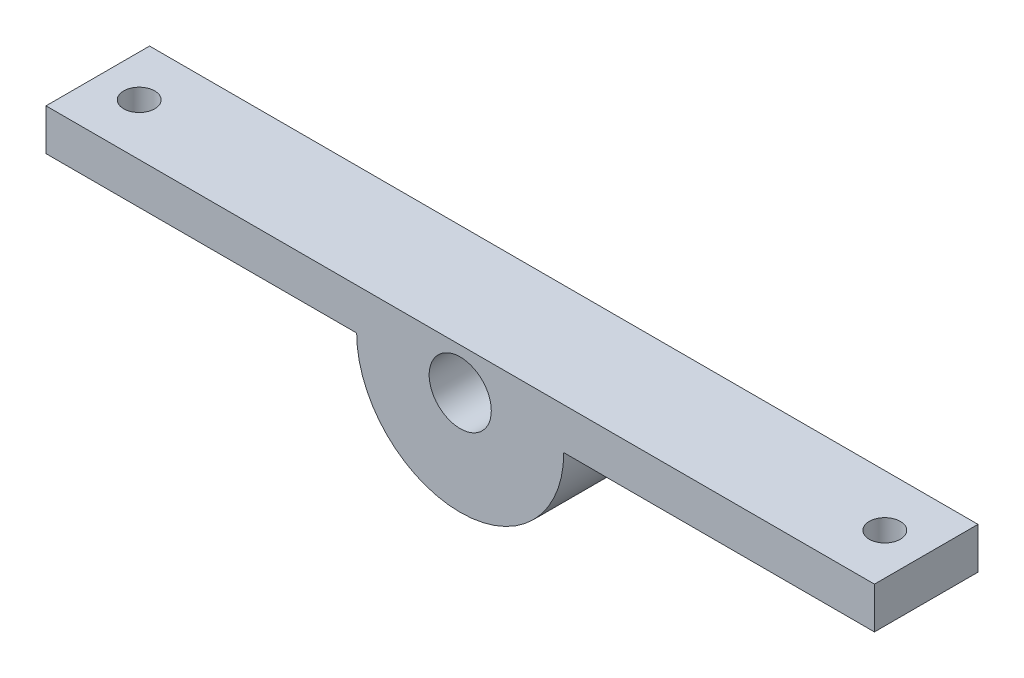
ISO-10303-21;
HEADER;
FILE_DESCRIPTION(('STEP AP214'),'2;1');
FILE_NAME('part.step','',(''),(''),'','','');
FILE_SCHEMA(('AUTOMOTIVE_DESIGN { 1 0 10303 214 1 1 1 1 }'));
ENDSEC;
DATA;
#1=APPLICATION_CONTEXT('core data for automotive mechanical design processes');
#2=APPLICATION_PROTOCOL_DEFINITION('international standard','automotive_design',2000,#1);
#3=PRODUCT_CONTEXT('',#1,'mechanical');
#4=PRODUCT('Part','Part','',(#3));
#5=PRODUCT_RELATED_PRODUCT_CATEGORY('part','',(#4));
#6=PRODUCT_DEFINITION_FORMATION('','',#4);
#7=PRODUCT_DEFINITION_CONTEXT('part definition',#1,'design');
#8=PRODUCT_DEFINITION('design','',#6,#7);
#9=PRODUCT_DEFINITION_SHAPE('','',#8);
#10=(LENGTH_UNIT() NAMED_UNIT(*) SI_UNIT(.MILLI.,.METRE.));
#11=(NAMED_UNIT(*) PLANE_ANGLE_UNIT() SI_UNIT($,.RADIAN.));
#12=(NAMED_UNIT(*) SI_UNIT($,.STERADIAN.) SOLID_ANGLE_UNIT());
#13=UNCERTAINTY_MEASURE_WITH_UNIT(LENGTH_MEASURE(1.E-05),#10,'distance_accuracy_value','');
#14=(GEOMETRIC_REPRESENTATION_CONTEXT(3) GLOBAL_UNCERTAINTY_ASSIGNED_CONTEXT((#13)) GLOBAL_UNIT_ASSIGNED_CONTEXT((#10,
#11,#12)) REPRESENTATION_CONTEXT('',''));
#15=CARTESIAN_POINT('',(0.,0.,0.));
#16=DIRECTION('',(0.,0.,1.));
#17=DIRECTION('',(1.,0.,0.));
#18=AXIS2_PLACEMENT_3D('',#15,#16,#17);
#19=CARTESIAN_POINT('',(0.,0.,10.));
#20=DIRECTION('',(0.,0.,1.));
#21=DIRECTION('',(1.,0.,0.));
#22=AXIS2_PLACEMENT_3D('',#19,#20,#21);
#23=PLANE('',#22);
#24=DIRECTION('',(-1.,0.,0.));
#25=VECTOR('',#24,1.);
#26=CARTESIAN_POINT('',(40.,4.,10.));
#27=LINE('',#26,#25);
#28=CARTESIAN_POINT('',(40.,4.,10.));
#29=VERTEX_POINT('',#28);
#30=CARTESIAN_POINT('',(-40.,4.,10.));
#31=VERTEX_POINT('',#30);
#32=EDGE_CURVE('E130',#29,#31,#27,.T.);
#33=ORIENTED_EDGE('',*,*,#32,.T.);
#34=DIRECTION('',(0.,-1.,0.));
#35=VECTOR('',#34,1.);
#36=CARTESIAN_POINT('',(-40.,4.,10.));
#37=LINE('',#36,#35);
#38=CARTESIAN_POINT('',(-40.,0.,10.));
#39=VERTEX_POINT('',#38);
#40=EDGE_CURVE('E88',#31,#39,#37,.T.);
#41=ORIENTED_EDGE('',*,*,#40,.T.);
#42=DIRECTION('',(1.,0.,0.));
#43=VECTOR('',#42,1.);
#44=CARTESIAN_POINT('',(-10.,0.,10.));
#45=LINE('',#44,#43);
#46=CARTESIAN_POINT('',(-10.,0.,10.));
#47=VERTEX_POINT('',#46);
#48=EDGE_CURVE('E101',#39,#47,#45,.T.);
#49=ORIENTED_EDGE('',*,*,#48,.T.);
#50=CARTESIAN_POINT('',(0.,0.,10.));
#51=DIRECTION('',(0.,0.,1.));
#52=DIRECTION('',(1.,0.,0.));
#53=AXIS2_PLACEMENT_3D('',#50,#51,#52);
#54=CIRCLE('',#53,10.);
#55=CARTESIAN_POINT('',(10.,0.,10.));
#56=VERTEX_POINT('',#55);
#57=EDGE_CURVE('E95',#47,#56,#54,.T.);
#58=ORIENTED_EDGE('',*,*,#57,.T.);
#59=DIRECTION('',(1.,0.,0.));
#60=VECTOR('',#59,1.);
#61=CARTESIAN_POINT('',(40.,0.,10.));
#62=LINE('',#61,#60);
#63=CARTESIAN_POINT('',(40.,0.,10.));
#64=VERTEX_POINT('',#63);
#65=EDGE_CURVE('E99',#56,#64,#62,.T.);
#66=ORIENTED_EDGE('',*,*,#65,.T.);
#67=DIRECTION('',(0.,1.,0.));
#68=VECTOR('',#67,1.);
#69=CARTESIAN_POINT('',(40.,4.,10.));
#70=LINE('',#69,#68);
#71=EDGE_CURVE('E51',#64,#29,#70,.T.);
#72=ORIENTED_EDGE('',*,*,#71,.T.);
#73=EDGE_LOOP('',(#33,#41,#49,#58,#66,#72));
#74=FACE_BOUND('',#73,.T.);
#75=CARTESIAN_POINT('',(0.,0.,10.));
#76=DIRECTION('',(0.,0.,1.));
#77=DIRECTION('',(1.,0.,0.));
#78=AXIS2_PLACEMENT_3D('',#75,#76,#77);
#79=CIRCLE('',#78,3.);
#80=CARTESIAN_POINT('',(3.,0.,10.));
#81=VERTEX_POINT('',#80);
#82=EDGE_CURVE('E123',#81,#81,#79,.T.);
#83=ORIENTED_EDGE('',*,*,#82,.F.);
#84=EDGE_LOOP('',(#83));
#85=FACE_BOUND('',#84,.T.);
#86=ADVANCED_FACE('F32',(#74,#85),#23,.T.);
#87=CARTESIAN_POINT('',(0.,0.,0.));
#88=DIRECTION('',(0.,0.,1.));
#89=DIRECTION('',(1.,0.,0.));
#90=AXIS2_PLACEMENT_3D('',#87,#88,#89);
#91=PLANE('',#90);
#92=DIRECTION('',(-1.,0.,0.));
#93=VECTOR('',#92,1.);
#94=CARTESIAN_POINT('',(40.,4.,0.));
#95=LINE('',#94,#93);
#96=CARTESIAN_POINT('',(40.,4.,0.));
#97=VERTEX_POINT('',#96);
#98=CARTESIAN_POINT('',(-40.,4.,0.));
#99=VERTEX_POINT('',#98);
#100=EDGE_CURVE('E119',#97,#99,#95,.T.);
#101=ORIENTED_EDGE('',*,*,#100,.F.);
#102=DIRECTION('',(0.,1.,0.));
#103=VECTOR('',#102,1.);
#104=CARTESIAN_POINT('',(40.,4.,0.));
#105=LINE('',#104,#103);
#106=CARTESIAN_POINT('',(40.,0.,0.));
#107=VERTEX_POINT('',#106);
#108=EDGE_CURVE('E80',#107,#97,#105,.T.);
#109=ORIENTED_EDGE('',*,*,#108,.F.);
#110=DIRECTION('',(1.,0.,0.));
#111=VECTOR('',#110,1.);
#112=CARTESIAN_POINT('',(40.,0.,0.));
#113=LINE('',#112,#111);
#114=CARTESIAN_POINT('',(10.,0.,0.));
#115=VERTEX_POINT('',#114);
#116=EDGE_CURVE('E74',#115,#107,#113,.T.);
#117=ORIENTED_EDGE('',*,*,#116,.F.);
#118=CARTESIAN_POINT('',(0.,0.,0.));
#119=DIRECTION('',(0.,0.,1.));
#120=DIRECTION('',(1.,0.,0.));
#121=AXIS2_PLACEMENT_3D('',#118,#119,#120);
#122=CIRCLE('',#121,10.);
#123=CARTESIAN_POINT('',(-10.,0.,0.));
#124=VERTEX_POINT('',#123);
#125=EDGE_CURVE('E109',#124,#115,#122,.T.);
#126=ORIENTED_EDGE('',*,*,#125,.F.);
#127=DIRECTION('',(1.,0.,0.));
#128=VECTOR('',#127,1.);
#129=CARTESIAN_POINT('',(-10.,0.,0.));
#130=LINE('',#129,#128);
#131=CARTESIAN_POINT('',(-40.,0.,0.));
#132=VERTEX_POINT('',#131);
#133=EDGE_CURVE('E125',#132,#124,#130,.T.);
#134=ORIENTED_EDGE('',*,*,#133,.F.);
#135=DIRECTION('',(0.,-1.,0.));
#136=VECTOR('',#135,1.);
#137=CARTESIAN_POINT('',(-40.,4.,0.));
#138=LINE('',#137,#136);
#139=EDGE_CURVE('E122',#99,#132,#138,.T.);
#140=ORIENTED_EDGE('',*,*,#139,.F.);
#141=EDGE_LOOP('',(#101,#109,#117,#126,#134,#140));
#142=FACE_BOUND('',#141,.T.);
#143=CARTESIAN_POINT('',(0.,0.,0.));
#144=DIRECTION('',(0.,0.,1.));
#145=DIRECTION('',(1.,0.,0.));
#146=AXIS2_PLACEMENT_3D('',#143,#144,#145);
#147=CIRCLE('',#146,3.);
#148=CARTESIAN_POINT('',(3.,0.,0.));
#149=VERTEX_POINT('',#148);
#150=EDGE_CURVE('E141',#149,#149,#147,.T.);
#151=ORIENTED_EDGE('',*,*,#150,.T.);
#152=EDGE_LOOP('',(#151));
#153=FACE_BOUND('',#152,.T.);
#154=ADVANCED_FACE('F163',(#142,#153),#91,.F.);
#155=CARTESIAN_POINT('',(40.,4.,10.));
#156=DIRECTION('',(0.,-1.,0.));
#157=DIRECTION('',(0.,0.,-1.));
#158=AXIS2_PLACEMENT_3D('',#155,#156,#157);
#159=PLANE('',#158);
#160=CARTESIAN_POINT('',(-36.,4.,5.));
#161=DIRECTION('',(0.,1.,0.));
#162=DIRECTION('',(0.,0.,1.));
#163=AXIS2_PLACEMENT_3D('',#160,#161,#162);
#164=CIRCLE('',#163,1.5);
#165=CARTESIAN_POINT('',(-36.,4.,6.5));
#166=VERTEX_POINT('',#165);
#167=EDGE_CURVE('E137',#166,#166,#164,.T.);
#168=ORIENTED_EDGE('',*,*,#167,.F.);
#169=EDGE_LOOP('',(#168));
#170=FACE_BOUND('',#169,.T.);
#171=CARTESIAN_POINT('',(36.,4.,5.));
#172=DIRECTION('',(0.,1.,0.));
#173=DIRECTION('',(0.,0.,1.));
#174=AXIS2_PLACEMENT_3D('',#171,#172,#173);
#175=CIRCLE('',#174,1.5);
#176=CARTESIAN_POINT('',(36.,4.,6.5));
#177=VERTEX_POINT('',#176);
#178=EDGE_CURVE('E143',#177,#177,#175,.T.);
#179=ORIENTED_EDGE('',*,*,#178,.F.);
#180=EDGE_LOOP('',(#179));
#181=FACE_BOUND('',#180,.T.);
#182=ORIENTED_EDGE('',*,*,#100,.T.);
#183=DIRECTION('',(0.,0.,-1.));
#184=VECTOR('',#183,1.);
#185=CARTESIAN_POINT('',(-40.,4.,10.));
#186=LINE('',#185,#184);
#187=EDGE_CURVE('E11',#31,#99,#186,.T.);
#188=ORIENTED_EDGE('',*,*,#187,.F.);
#189=ORIENTED_EDGE('',*,*,#32,.F.);
#190=DIRECTION('',(0.,0.,-1.));
#191=VECTOR('',#190,1.);
#192=CARTESIAN_POINT('',(40.,4.,10.));
#193=LINE('',#192,#191);
#194=EDGE_CURVE('E115',#29,#97,#193,.T.);
#195=ORIENTED_EDGE('',*,*,#194,.T.);
#196=EDGE_LOOP('',(#182,#188,#189,#195));
#197=FACE_BOUND('',#196,.T.);
#198=ADVANCED_FACE('F34',(#170,#181,#197),#159,.F.);
#199=CARTESIAN_POINT('',(-40.,4.,10.));
#200=DIRECTION('',(1.,0.,0.));
#201=DIRECTION('',(0.,0.,-1.));
#202=AXIS2_PLACEMENT_3D('',#199,#200,#201);
#203=PLANE('',#202);
#204=ORIENTED_EDGE('',*,*,#139,.T.);
#205=DIRECTION('',(0.,0.,-1.));
#206=VECTOR('',#205,1.);
#207=CARTESIAN_POINT('',(-40.,0.,10.));
#208=LINE('',#207,#206);
#209=EDGE_CURVE('E42',#39,#132,#208,.T.);
#210=ORIENTED_EDGE('',*,*,#209,.F.);
#211=ORIENTED_EDGE('',*,*,#40,.F.);
#212=ORIENTED_EDGE('',*,*,#187,.T.);
#213=EDGE_LOOP('',(#204,#210,#211,#212));
#214=FACE_BOUND('',#213,.T.);
#215=ADVANCED_FACE('F157',(#214),#203,.F.);
#216=CARTESIAN_POINT('',(-10.,0.,10.));
#217=DIRECTION('',(0.,1.,0.));
#218=DIRECTION('',(-1.,0.,0.));
#219=AXIS2_PLACEMENT_3D('',#216,#217,#218);
#220=PLANE('',#219);
#221=CARTESIAN_POINT('',(-36.,0.,5.));
#222=DIRECTION('',(0.,1.,0.));
#223=DIRECTION('',(-1.,0.,0.));
#224=AXIS2_PLACEMENT_3D('',#221,#222,#223);
#225=CIRCLE('',#224,1.5);
#226=CARTESIAN_POINT('',(-37.5,0.,5.));
#227=VERTEX_POINT('',#226);
#228=EDGE_CURVE('E36',#227,#227,#225,.T.);
#229=ORIENTED_EDGE('',*,*,#228,.T.);
#230=EDGE_LOOP('',(#229));
#231=FACE_BOUND('',#230,.T.);
#232=ORIENTED_EDGE('',*,*,#133,.T.);
#233=DIRECTION('',(0.,0.,-1.));
#234=VECTOR('',#233,1.);
#235=CARTESIAN_POINT('',(-10.,0.,10.));
#236=LINE('',#235,#234);
#237=EDGE_CURVE('E110',#47,#124,#236,.T.);
#238=ORIENTED_EDGE('',*,*,#237,.F.);
#239=ORIENTED_EDGE('',*,*,#48,.F.);
#240=ORIENTED_EDGE('',*,*,#209,.T.);
#241=EDGE_LOOP('',(#232,#238,#239,#240));
#242=FACE_BOUND('',#241,.T.);
#243=ADVANCED_FACE('F160',(#231,#242),#220,.F.);
#244=CARTESIAN_POINT('',(0.,0.,10.));
#245=DIRECTION('',(0.,0.,-1.));
#246=DIRECTION('',(-1.,0.,0.));
#247=AXIS2_PLACEMENT_3D('',#244,#245,#246);
#248=CYLINDRICAL_SURFACE('',#247,10.);
#249=ORIENTED_EDGE('',*,*,#125,.T.);
#250=DIRECTION('',(0.,0.,-1.));
#251=VECTOR('',#250,1.);
#252=CARTESIAN_POINT('',(10.,0.,10.));
#253=LINE('',#252,#251);
#254=EDGE_CURVE('E106',#56,#115,#253,.T.);
#255=ORIENTED_EDGE('',*,*,#254,.F.);
#256=ORIENTED_EDGE('',*,*,#57,.F.);
#257=ORIENTED_EDGE('',*,*,#237,.T.);
#258=EDGE_LOOP('',(#249,#255,#256,#257));
#259=FACE_BOUND('',#258,.T.);
#260=ADVANCED_FACE('F107',(#259),#248,.T.);
#261=CARTESIAN_POINT('',(40.,0.,10.));
#262=DIRECTION('',(0.,1.,0.));
#263=DIRECTION('',(-1.,0.,0.));
#264=AXIS2_PLACEMENT_3D('',#261,#262,#263);
#265=PLANE('',#264);
#266=CARTESIAN_POINT('',(36.,0.,5.));
#267=DIRECTION('',(0.,1.,0.));
#268=DIRECTION('',(-1.,0.,0.));
#269=AXIS2_PLACEMENT_3D('',#266,#267,#268);
#270=CIRCLE('',#269,1.5);
#271=CARTESIAN_POINT('',(34.5,0.,5.));
#272=VERTEX_POINT('',#271);
#273=EDGE_CURVE('E135',#272,#272,#270,.T.);
#274=ORIENTED_EDGE('',*,*,#273,.T.);
#275=EDGE_LOOP('',(#274));
#276=FACE_BOUND('',#275,.T.);
#277=ORIENTED_EDGE('',*,*,#116,.T.);
#278=DIRECTION('',(0.,0.,-1.));
#279=VECTOR('',#278,1.);
#280=CARTESIAN_POINT('',(40.,0.,10.));
#281=LINE('',#280,#279);
#282=EDGE_CURVE('E111',#64,#107,#281,.T.);
#283=ORIENTED_EDGE('',*,*,#282,.F.);
#284=ORIENTED_EDGE('',*,*,#65,.F.);
#285=ORIENTED_EDGE('',*,*,#254,.T.);
#286=EDGE_LOOP('',(#277,#283,#284,#285));
#287=FACE_BOUND('',#286,.T.);
#288=ADVANCED_FACE('F113',(#276,#287),#265,.F.);
#289=CARTESIAN_POINT('',(40.,4.,10.));
#290=DIRECTION('',(-1.,0.,0.));
#291=DIRECTION('',(0.,0.,1.));
#292=AXIS2_PLACEMENT_3D('',#289,#290,#291);
#293=PLANE('',#292);
#294=ORIENTED_EDGE('',*,*,#108,.T.);
#295=ORIENTED_EDGE('',*,*,#194,.F.);
#296=ORIENTED_EDGE('',*,*,#71,.F.);
#297=ORIENTED_EDGE('',*,*,#282,.T.);
#298=EDGE_LOOP('',(#294,#295,#296,#297));
#299=FACE_BOUND('',#298,.T.);
#300=ADVANCED_FACE('F166',(#299),#293,.F.);
#301=CARTESIAN_POINT('',(0.,0.,10.));
#302=DIRECTION('',(0.,0.,-1.));
#303=DIRECTION('',(-1.,0.,0.));
#304=AXIS2_PLACEMENT_3D('',#301,#302,#303);
#305=CYLINDRICAL_SURFACE('',#304,3.);
#306=ORIENTED_EDGE('',*,*,#82,.T.);
#307=EDGE_LOOP('',(#306));
#308=FACE_BOUND('',#307,.T.);
#309=ORIENTED_EDGE('',*,*,#150,.F.);
#310=EDGE_LOOP('',(#309));
#311=FACE_BOUND('',#310,.T.);
#312=ADVANCED_FACE('F168',(#308,#311),#305,.F.);
#313=CARTESIAN_POINT('',(36.,-10.,5.));
#314=DIRECTION('',(0.,1.,0.));
#315=DIRECTION('',(0.,0.,1.));
#316=AXIS2_PLACEMENT_3D('',#313,#314,#315);
#317=CYLINDRICAL_SURFACE('',#316,1.5);
#318=ORIENTED_EDGE('',*,*,#178,.T.);
#319=EDGE_LOOP('',(#318));
#320=FACE_BOUND('',#319,.T.);
#321=ORIENTED_EDGE('',*,*,#273,.F.);
#322=EDGE_LOOP('',(#321));
#323=FACE_BOUND('',#322,.T.);
#324=ADVANCED_FACE('F174',(#320,#323),#317,.F.);
#325=CARTESIAN_POINT('',(-36.,-10.,5.));
#326=DIRECTION('',(0.,1.,0.));
#327=DIRECTION('',(0.,0.,1.));
#328=AXIS2_PLACEMENT_3D('',#325,#326,#327);
#329=CYLINDRICAL_SURFACE('',#328,1.5);
#330=ORIENTED_EDGE('',*,*,#167,.T.);
#331=EDGE_LOOP('',(#330));
#332=FACE_BOUND('',#331,.T.);
#333=ORIENTED_EDGE('',*,*,#228,.F.);
#334=EDGE_LOOP('',(#333));
#335=FACE_BOUND('',#334,.T.);
#336=ADVANCED_FACE('F187',(#332,#335),#329,.F.);
#337=CLOSED_SHELL('',(#86,#154,#198,#215,#243,#260,#288,#300,#312,#324,#336));
#338=MANIFOLD_SOLID_BREP('B2',#337);
#339=ADVANCED_BREP_SHAPE_REPRESENTATION('',(#18,#338),#14);
#340=SHAPE_DEFINITION_REPRESENTATION(#9,#339);
ENDSEC;
END-ISO-10303-21;
